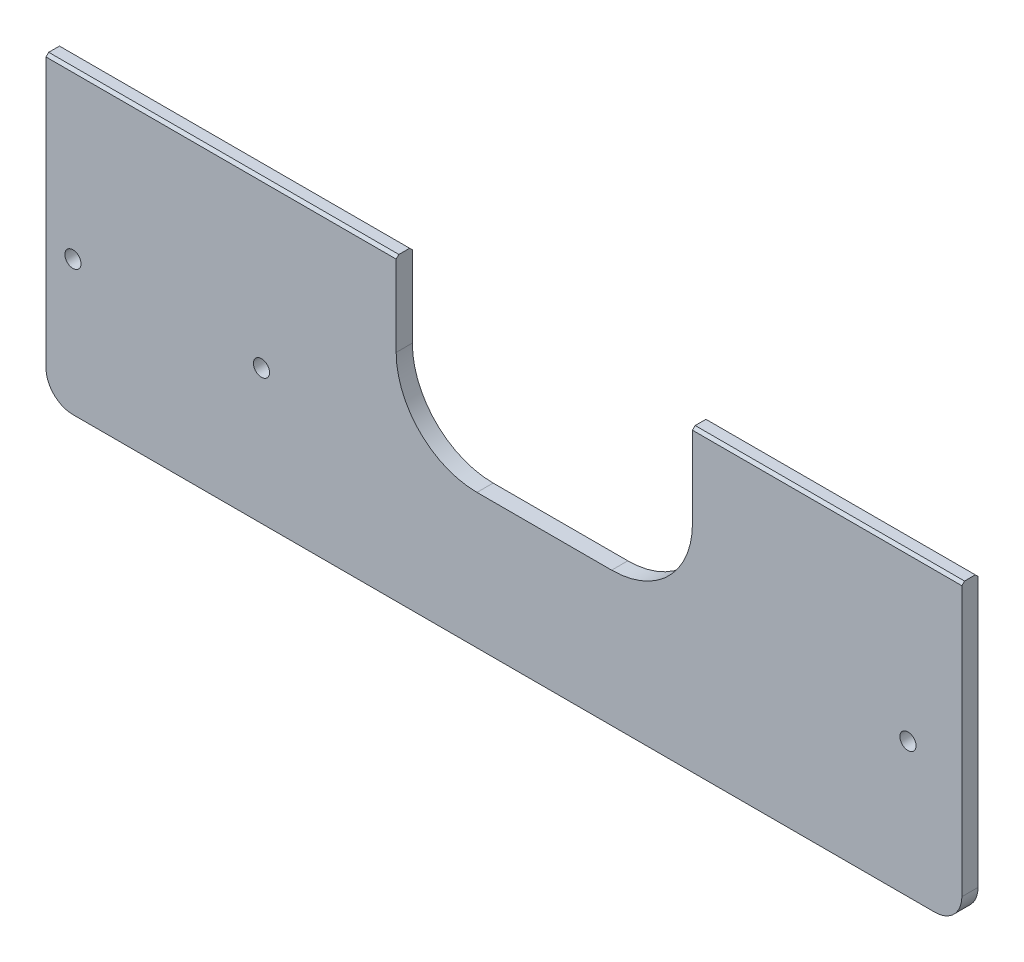
ISO-10303-21;
HEADER;
FILE_DESCRIPTION(('STEP AP214'),'2;1');
FILE_NAME('part.step','',(''),(''),'','','');
FILE_SCHEMA(('AUTOMOTIVE_DESIGN { 1 0 10303 214 1 1 1 1 }'));
ENDSEC;
DATA;
#1=APPLICATION_CONTEXT('core data for automotive mechanical design processes');
#2=APPLICATION_PROTOCOL_DEFINITION('international standard','automotive_design',2000,#1);
#3=PRODUCT_CONTEXT('',#1,'mechanical');
#4=PRODUCT('Part','Part','',(#3));
#5=PRODUCT_RELATED_PRODUCT_CATEGORY('part','',(#4));
#6=PRODUCT_DEFINITION_FORMATION('','',#4);
#7=PRODUCT_DEFINITION_CONTEXT('part definition',#1,'design');
#8=PRODUCT_DEFINITION('design','',#6,#7);
#9=PRODUCT_DEFINITION_SHAPE('','',#8);
#10=(LENGTH_UNIT() NAMED_UNIT(*) SI_UNIT(.MILLI.,.METRE.));
#11=(NAMED_UNIT(*) PLANE_ANGLE_UNIT() SI_UNIT($,.RADIAN.));
#12=(NAMED_UNIT(*) SI_UNIT($,.STERADIAN.) SOLID_ANGLE_UNIT());
#13=UNCERTAINTY_MEASURE_WITH_UNIT(LENGTH_MEASURE(1.E-05),#10,'distance_accuracy_value','');
#14=(GEOMETRIC_REPRESENTATION_CONTEXT(3) GLOBAL_UNCERTAINTY_ASSIGNED_CONTEXT((#13)) GLOBAL_UNIT_ASSIGNED_CONTEXT((#10,
#11,#12)) REPRESENTATION_CONTEXT('',''));
#15=CARTESIAN_POINT('',(0.,0.,0.));
#16=DIRECTION('',(0.,0.,1.));
#17=DIRECTION('',(1.,0.,0.));
#18=AXIS2_PLACEMENT_3D('',#15,#16,#17);
#19=CARTESIAN_POINT('',(-100.,15.,3.));
#20=DIRECTION('',(0.,-1.,0.));
#21=DIRECTION('',(0.,0.,-1.));
#22=AXIS2_PLACEMENT_3D('',#19,#20,#21);
#23=PLANE('',#22);
#24=DIRECTION('',(0.,0.,1.));
#25=VECTOR('',#24,1.);
#26=CARTESIAN_POINT('',(-35.,15.,0.));
#27=LINE('',#26,#25);
#28=CARTESIAN_POINT('',(-35.,15.,0.499999999999973));
#29=VERTEX_POINT('',#28);
#30=CARTESIAN_POINT('',(-35.,15.,2.5));
#31=VERTEX_POINT('',#30);
#32=EDGE_CURVE('E227',#29,#31,#27,.T.);
#33=ORIENTED_EDGE('',*,*,#32,.F.);
#34=DIRECTION('',(-1.,0.,0.));
#35=VECTOR('',#34,1.);
#36=CARTESIAN_POINT('',(-100.,15.,0.499999999999973));
#37=LINE('',#36,#35);
#38=CARTESIAN_POINT('',(-100.,15.,0.499999999999973));
#39=VERTEX_POINT('',#38);
#40=EDGE_CURVE('E340',#29,#39,#37,.T.);
#41=ORIENTED_EDGE('',*,*,#40,.T.);
#42=DIRECTION('',(0.,0.,-1.));
#43=VECTOR('',#42,1.);
#44=CARTESIAN_POINT('',(-100.,15.,3.));
#45=LINE('',#44,#43);
#46=CARTESIAN_POINT('',(-100.,15.,2.5));
#47=VERTEX_POINT('',#46);
#48=EDGE_CURVE('E267',#47,#39,#45,.T.);
#49=ORIENTED_EDGE('',*,*,#48,.F.);
#50=DIRECTION('',(1.,0.,0.));
#51=VECTOR('',#50,1.);
#52=CARTESIAN_POINT('',(-35.,15.,2.5));
#53=LINE('',#52,#51);
#54=EDGE_CURVE('E337',#47,#31,#53,.T.);
#55=ORIENTED_EDGE('',*,*,#54,.T.);
#56=EDGE_LOOP('',(#33,#41,#49,#55));
#57=FACE_BOUND('',#56,.T.);
#58=ADVANCED_FACE('F47',(#57),#23,.F.);
#59=CARTESIAN_POINT('',(-100.,15.,3.));
#60=DIRECTION('',(1.,0.,0.));
#61=DIRECTION('',(0.,0.,-1.));
#62=AXIS2_PLACEMENT_3D('',#59,#60,#61);
#63=PLANE('',#62);
#64=ORIENTED_EDGE('',*,*,#48,.T.);
#65=DIRECTION('',(0.,0.707106781186567,0.707106781186528));
#66=VECTOR('',#65,1.);
#67=CARTESIAN_POINT('',(-100.,15.,0.499999999999973));
#68=LINE('',#67,#66);
#69=CARTESIAN_POINT('',(-100.,14.5,0.));
#70=VERTEX_POINT('',#69);
#71=EDGE_CURVE('E346',#39,#70,#68,.F.);
#72=ORIENTED_EDGE('',*,*,#71,.T.);
#73=DIRECTION('',(0.,-1.,0.));
#74=VECTOR('',#73,1.);
#75=CARTESIAN_POINT('',(-100.,15.,0.));
#76=LINE('',#75,#74);
#77=CARTESIAN_POINT('',(-100.,-35.5,0.));
#78=VERTEX_POINT('',#77);
#79=EDGE_CURVE('E243',#70,#78,#76,.T.);
#80=ORIENTED_EDGE('',*,*,#79,.T.);
#81=DIRECTION('',(0.,0.,-1.));
#82=VECTOR('',#81,1.);
#83=CARTESIAN_POINT('',(-100.,-35.5,3.));
#84=LINE('',#83,#82);
#85=CARTESIAN_POINT('',(-100.,-35.5,3.));
#86=VERTEX_POINT('',#85);
#87=EDGE_CURVE('E298',#78,#86,#84,.F.);
#88=ORIENTED_EDGE('',*,*,#87,.T.);
#89=DIRECTION('',(0.,-1.,0.));
#90=VECTOR('',#89,1.);
#91=CARTESIAN_POINT('',(-100.,15.,3.));
#92=LINE('',#91,#90);
#93=CARTESIAN_POINT('',(-100.,14.5,3.));
#94=VERTEX_POINT('',#93);
#95=EDGE_CURVE('E255',#94,#86,#92,.T.);
#96=ORIENTED_EDGE('',*,*,#95,.F.);
#97=DIRECTION('',(0.,0.707106781186548,-0.707106781186548));
#98=VECTOR('',#97,1.);
#99=CARTESIAN_POINT('',(-100.,14.5,3.));
#100=LINE('',#99,#98);
#101=EDGE_CURVE('E72',#94,#47,#100,.T.);
#102=ORIENTED_EDGE('',*,*,#101,.T.);
#103=EDGE_LOOP('',(#64,#72,#80,#88,#96,#102));
#104=FACE_BOUND('',#103,.T.);
#105=ADVANCED_FACE('F359',(#104),#63,.F.);
#106=CARTESIAN_POINT('',(-100.,-40.5,3.));
#107=DIRECTION('',(0.,1.,0.));
#108=DIRECTION('',(0.,0.,1.));
#109=AXIS2_PLACEMENT_3D('',#106,#107,#108);
#110=PLANE('',#109);
#111=DIRECTION('',(1.,0.,0.));
#112=VECTOR('',#111,1.);
#113=CARTESIAN_POINT('',(-100.,-40.5,3.));
#114=LINE('',#113,#112);
#115=CARTESIAN_POINT('',(-95.,-40.5,3.));
#116=VERTEX_POINT('',#115);
#117=CARTESIAN_POINT('',(65.,-40.5,3.));
#118=VERTEX_POINT('',#117);
#119=EDGE_CURVE('E258',#116,#118,#114,.T.);
#120=ORIENTED_EDGE('',*,*,#119,.F.);
#121=DIRECTION('',(0.,0.,-1.));
#122=VECTOR('',#121,1.);
#123=CARTESIAN_POINT('',(-95.,-40.5,3.));
#124=LINE('',#123,#122);
#125=CARTESIAN_POINT('',(-95.,-40.5,0.));
#126=VERTEX_POINT('',#125);
#127=EDGE_CURVE('E287',#116,#126,#124,.T.);
#128=ORIENTED_EDGE('',*,*,#127,.T.);
#129=DIRECTION('',(1.,0.,0.));
#130=VECTOR('',#129,1.);
#131=CARTESIAN_POINT('',(-100.,-40.5,0.));
#132=LINE('',#131,#130);
#133=CARTESIAN_POINT('',(65.,-40.5,0.));
#134=VERTEX_POINT('',#133);
#135=EDGE_CURVE('E270',#126,#134,#132,.T.);
#136=ORIENTED_EDGE('',*,*,#135,.T.);
#137=DIRECTION('',(0.,0.,-1.));
#138=VECTOR('',#137,1.);
#139=CARTESIAN_POINT('',(65.,-40.5,3.));
#140=LINE('',#139,#138);
#141=EDGE_CURVE('E284',#134,#118,#140,.F.);
#142=ORIENTED_EDGE('',*,*,#141,.T.);
#143=EDGE_LOOP('',(#120,#128,#136,#142));
#144=FACE_BOUND('',#143,.T.);
#145=ADVANCED_FACE('F370',(#144),#110,.F.);
#146=CARTESIAN_POINT('',(70.,15.,3.));
#147=DIRECTION('',(-1.,0.,0.));
#148=DIRECTION('',(0.,-1.,0.));
#149=AXIS2_PLACEMENT_3D('',#146,#147,#148);
#150=PLANE('',#149);
#151=DIRECTION('',(0.,1.,0.));
#152=VECTOR('',#151,1.);
#153=CARTESIAN_POINT('',(70.,15.,0.));
#154=LINE('',#153,#152);
#155=CARTESIAN_POINT('',(70.,-35.5,0.));
#156=VERTEX_POINT('',#155);
#157=CARTESIAN_POINT('',(70.,14.5,0.));
#158=VERTEX_POINT('',#157);
#159=EDGE_CURVE('E259',#156,#158,#154,.T.);
#160=ORIENTED_EDGE('',*,*,#159,.T.);
#161=DIRECTION('',(0.,-0.707106781186567,-0.707106781186528));
#162=VECTOR('',#161,1.);
#163=CARTESIAN_POINT('',(70.,15.,0.499999999999951));
#164=LINE('',#163,#162);
#165=CARTESIAN_POINT('',(70.,15.,0.499999999999973));
#166=VERTEX_POINT('',#165);
#167=EDGE_CURVE('E334',#158,#166,#164,.F.);
#168=ORIENTED_EDGE('',*,*,#167,.T.);
#169=DIRECTION('',(0.,0.,-1.));
#170=VECTOR('',#169,1.);
#171=CARTESIAN_POINT('',(70.,15.,3.));
#172=LINE('',#171,#170);
#173=CARTESIAN_POINT('',(70.,15.,2.5));
#174=VERTEX_POINT('',#173);
#175=EDGE_CURVE('E280',#174,#166,#172,.T.);
#176=ORIENTED_EDGE('',*,*,#175,.F.);
#177=DIRECTION('',(0.,-0.707106781186548,0.707106781186548));
#178=VECTOR('',#177,1.);
#179=CARTESIAN_POINT('',(70.,14.5,3.00000000000001));
#180=LINE('',#179,#178);
#181=CARTESIAN_POINT('',(70.,14.5,3.));
#182=VERTEX_POINT('',#181);
#183=EDGE_CURVE('E331',#174,#182,#180,.T.);
#184=ORIENTED_EDGE('',*,*,#183,.T.);
#185=DIRECTION('',(0.,1.,0.));
#186=VECTOR('',#185,1.);
#187=CARTESIAN_POINT('',(70.,15.,3.));
#188=LINE('',#187,#186);
#189=CARTESIAN_POINT('',(70.,-35.5,3.));
#190=VERTEX_POINT('',#189);
#191=EDGE_CURVE('E263',#190,#182,#188,.T.);
#192=ORIENTED_EDGE('',*,*,#191,.F.);
#193=DIRECTION('',(0.,0.,-1.));
#194=VECTOR('',#193,1.);
#195=CARTESIAN_POINT('',(70.,-35.5,3.));
#196=LINE('',#195,#194);
#197=EDGE_CURVE('E308',#190,#156,#196,.T.);
#198=ORIENTED_EDGE('',*,*,#197,.T.);
#199=EDGE_LOOP('',(#160,#168,#176,#184,#192,#198));
#200=FACE_BOUND('',#199,.T.);
#201=ADVANCED_FACE('F379',(#200),#150,.F.);
#202=ORIENTED_EDGE('',*,*,#175,.T.);
#203=DIRECTION('',(-1.,0.,0.));
#204=VECTOR('',#203,1.);
#205=CARTESIAN_POINT('',(-100.,15.,0.499999999999973));
#206=LINE('',#205,#204);
#207=CARTESIAN_POINT('',(20.,15.,0.499999999999973));
#208=VERTEX_POINT('',#207);
#209=EDGE_CURVE('E315',#166,#208,#206,.T.);
#210=ORIENTED_EDGE('',*,*,#209,.T.);
#211=DIRECTION('',(0.,0.,1.));
#212=VECTOR('',#211,1.);
#213=CARTESIAN_POINT('',(20.,15.,0.));
#214=LINE('',#213,#212);
#215=CARTESIAN_POINT('',(20.,15.,2.5));
#216=VERTEX_POINT('',#215);
#217=EDGE_CURVE('E230',#208,#216,#214,.T.);
#218=ORIENTED_EDGE('',*,*,#217,.T.);
#219=DIRECTION('',(1.,0.,0.));
#220=VECTOR('',#219,1.);
#221=CARTESIAN_POINT('',(70.,15.,2.5));
#222=LINE('',#221,#220);
#223=EDGE_CURVE('E312',#216,#174,#222,.T.);
#224=ORIENTED_EDGE('',*,*,#223,.T.);
#225=EDGE_LOOP('',(#202,#210,#218,#224));
#226=FACE_BOUND('',#225,.T.);
#227=ADVANCED_FACE('F400',(#226),#23,.F.);
#228=CARTESIAN_POINT('',(0.,0.,3.));
#229=DIRECTION('',(0.,0.,1.));
#230=DIRECTION('',(1.,0.,0.));
#231=AXIS2_PLACEMENT_3D('',#228,#229,#230);
#232=PLANE('',#231);
#233=CARTESIAN_POINT('',(-95.,-15.5,3.));
#234=DIRECTION('',(0.,0.,1.));
#235=DIRECTION('',(1.,0.,0.));
#236=AXIS2_PLACEMENT_3D('',#233,#234,#235);
#237=CIRCLE('',#236,1.5);
#238=CARTESIAN_POINT('',(-93.5,-15.5,3.));
#239=VERTEX_POINT('',#238);
#240=EDGE_CURVE('E200',#239,#239,#237,.T.);
#241=ORIENTED_EDGE('',*,*,#240,.F.);
#242=EDGE_LOOP('',(#241));
#243=FACE_BOUND('',#242,.T.);
#244=ORIENTED_EDGE('',*,*,#191,.T.);
#245=DIRECTION('',(-1.,0.,0.));
#246=VECTOR('',#245,1.);
#247=CARTESIAN_POINT('',(20.,14.5,3.));
#248=LINE('',#247,#246);
#249=CARTESIAN_POINT('',(20.,14.5,3.));
#250=VERTEX_POINT('',#249);
#251=EDGE_CURVE('E11',#182,#250,#248,.T.);
#252=ORIENTED_EDGE('',*,*,#251,.T.);
#253=DIRECTION('',(0.,1.,0.));
#254=VECTOR('',#253,1.);
#255=CARTESIAN_POINT('',(20.,15.,3.));
#256=LINE('',#255,#254);
#257=CARTESIAN_POINT('',(20.,-0.5,3.));
#258=VERTEX_POINT('',#257);
#259=EDGE_CURVE('E197',#258,#250,#256,.T.);
#260=ORIENTED_EDGE('',*,*,#259,.F.);
#261=CARTESIAN_POINT('',(5.,-0.5,3.));
#262=DIRECTION('',(0.,0.,1.));
#263=DIRECTION('',(1.,0.,0.));
#264=AXIS2_PLACEMENT_3D('',#261,#262,#263);
#265=CIRCLE('',#264,15.);
#266=CARTESIAN_POINT('',(5.,-15.5,3.));
#267=VERTEX_POINT('',#266);
#268=EDGE_CURVE('E216',#267,#258,#265,.T.);
#269=ORIENTED_EDGE('',*,*,#268,.F.);
#270=DIRECTION('',(1.,0.,0.));
#271=VECTOR('',#270,1.);
#272=CARTESIAN_POINT('',(-20.,-15.5,3.));
#273=LINE('',#272,#271);
#274=CARTESIAN_POINT('',(-20.,-15.5,3.));
#275=VERTEX_POINT('',#274);
#276=EDGE_CURVE('E212',#275,#267,#273,.T.);
#277=ORIENTED_EDGE('',*,*,#276,.F.);
#278=CARTESIAN_POINT('',(-20.,-0.500000000000001,3.));
#279=DIRECTION('',(0.,0.,1.));
#280=DIRECTION('',(1.,0.,0.));
#281=AXIS2_PLACEMENT_3D('',#278,#279,#280);
#282=CIRCLE('',#281,15.);
#283=CARTESIAN_POINT('',(-35.,-0.499999999999999,3.));
#284=VERTEX_POINT('',#283);
#285=EDGE_CURVE('E171',#284,#275,#282,.T.);
#286=ORIENTED_EDGE('',*,*,#285,.F.);
#287=DIRECTION('',(0.,-1.,0.));
#288=VECTOR('',#287,1.);
#289=CARTESIAN_POINT('',(-35.,-0.499999999999999,3.));
#290=LINE('',#289,#288);
#291=CARTESIAN_POINT('',(-35.,14.5,3.));
#292=VERTEX_POINT('',#291);
#293=EDGE_CURVE('E194',#292,#284,#290,.T.);
#294=ORIENTED_EDGE('',*,*,#293,.F.);
#295=DIRECTION('',(-1.,0.,0.));
#296=VECTOR('',#295,1.);
#297=CARTESIAN_POINT('',(-100.,14.5,3.));
#298=LINE('',#297,#296);
#299=EDGE_CURVE('E57',#292,#94,#298,.T.);
#300=ORIENTED_EDGE('',*,*,#299,.T.);
#301=ORIENTED_EDGE('',*,*,#95,.T.);
#302=CARTESIAN_POINT('',(-95.,-35.5,3.));
#303=DIRECTION('',(0.,0.,1.));
#304=DIRECTION('',(1.,0.,0.));
#305=AXIS2_PLACEMENT_3D('',#302,#303,#304);
#306=CIRCLE('',#305,5.);
#307=EDGE_CURVE('E305',#86,#116,#306,.T.);
#308=ORIENTED_EDGE('',*,*,#307,.T.);
#309=ORIENTED_EDGE('',*,*,#119,.T.);
#310=CARTESIAN_POINT('',(65.,-35.5,3.));
#311=DIRECTION('',(0.,0.,1.));
#312=DIRECTION('',(1.,0.,0.));
#313=AXIS2_PLACEMENT_3D('',#310,#311,#312);
#314=CIRCLE('',#313,5.);
#315=EDGE_CURVE('E302',#118,#190,#314,.T.);
#316=ORIENTED_EDGE('',*,*,#315,.T.);
#317=EDGE_LOOP('',(#244,#252,#260,#269,#277,#286,#294,#300,#301,#308,#309,#316));
#318=FACE_BOUND('',#317,.T.);
#319=CARTESIAN_POINT('',(60.,-15.5,3.));
#320=DIRECTION('',(0.,0.,1.));
#321=DIRECTION('',(1.,0.,0.));
#322=AXIS2_PLACEMENT_3D('',#319,#320,#321);
#323=CIRCLE('',#322,1.49999999999999);
#324=CARTESIAN_POINT('',(61.5,-15.5,3.));
#325=VERTEX_POINT('',#324);
#326=EDGE_CURVE('E244',#325,#325,#323,.T.);
#327=ORIENTED_EDGE('',*,*,#326,.F.);
#328=EDGE_LOOP('',(#327));
#329=FACE_BOUND('',#328,.T.);
#330=CARTESIAN_POINT('',(-60.,-15.5,3.));
#331=DIRECTION('',(0.,0.,1.));
#332=DIRECTION('',(1.,0.,0.));
#333=AXIS2_PLACEMENT_3D('',#330,#331,#332);
#334=CIRCLE('',#333,1.5);
#335=CARTESIAN_POINT('',(-58.5,-15.5,3.));
#336=VERTEX_POINT('',#335);
#337=EDGE_CURVE('E248',#336,#336,#334,.T.);
#338=ORIENTED_EDGE('',*,*,#337,.F.);
#339=EDGE_LOOP('',(#338));
#340=FACE_BOUND('',#339,.T.);
#341=ADVANCED_FACE('F356',(#243,#318,#329,#340),#232,.T.);
#342=CARTESIAN_POINT('',(0.,0.,0.));
#343=DIRECTION('',(0.,0.,1.));
#344=DIRECTION('',(1.,0.,0.));
#345=AXIS2_PLACEMENT_3D('',#342,#343,#344);
#346=PLANE('',#345);
#347=CARTESIAN_POINT('',(-95.,-15.5,0.));
#348=DIRECTION('',(0.,0.,1.));
#349=DIRECTION('',(1.,0.,0.));
#350=AXIS2_PLACEMENT_3D('',#347,#348,#349);
#351=CIRCLE('',#350,1.5);
#352=CARTESIAN_POINT('',(-93.5,-15.5,0.));
#353=VERTEX_POINT('',#352);
#354=EDGE_CURVE('E213',#353,#353,#351,.T.);
#355=ORIENTED_EDGE('',*,*,#354,.T.);
#356=EDGE_LOOP('',(#355));
#357=FACE_BOUND('',#356,.T.);
#358=DIRECTION('',(0.,1.,0.));
#359=VECTOR('',#358,1.);
#360=CARTESIAN_POINT('',(20.,15.,0.));
#361=LINE('',#360,#359);
#362=CARTESIAN_POINT('',(20.,-0.5,0.));
#363=VERTEX_POINT('',#362);
#364=CARTESIAN_POINT('',(20.,14.5,0.));
#365=VERTEX_POINT('',#364);
#366=EDGE_CURVE('E205',#363,#365,#361,.T.);
#367=ORIENTED_EDGE('',*,*,#366,.T.);
#368=DIRECTION('',(1.,0.,0.));
#369=VECTOR('',#368,1.);
#370=CARTESIAN_POINT('',(0.,14.5,0.));
#371=LINE('',#370,#369);
#372=EDGE_CURVE('E328',#365,#158,#371,.T.);
#373=ORIENTED_EDGE('',*,*,#372,.T.);
#374=ORIENTED_EDGE('',*,*,#159,.F.);
#375=CARTESIAN_POINT('',(65.,-35.5,0.));
#376=DIRECTION('',(0.,0.,1.));
#377=DIRECTION('',(1.,0.,0.));
#378=AXIS2_PLACEMENT_3D('',#375,#376,#377);
#379=CIRCLE('',#378,5.);
#380=EDGE_CURVE('E291',#156,#134,#379,.F.);
#381=ORIENTED_EDGE('',*,*,#380,.T.);
#382=ORIENTED_EDGE('',*,*,#135,.F.);
#383=CARTESIAN_POINT('',(-95.,-35.5,0.));
#384=DIRECTION('',(0.,0.,1.));
#385=DIRECTION('',(1.,0.,0.));
#386=AXIS2_PLACEMENT_3D('',#383,#384,#385);
#387=CIRCLE('',#386,5.);
#388=EDGE_CURVE('E294',#126,#78,#387,.F.);
#389=ORIENTED_EDGE('',*,*,#388,.T.);
#390=ORIENTED_EDGE('',*,*,#79,.F.);
#391=DIRECTION('',(1.,0.,0.));
#392=VECTOR('',#391,1.);
#393=CARTESIAN_POINT('',(0.,14.5,0.));
#394=LINE('',#393,#392);
#395=CARTESIAN_POINT('',(-35.,14.5,0.));
#396=VERTEX_POINT('',#395);
#397=EDGE_CURVE('E325',#70,#396,#394,.T.);
#398=ORIENTED_EDGE('',*,*,#397,.T.);
#399=DIRECTION('',(0.,-1.,0.));
#400=VECTOR('',#399,1.);
#401=CARTESIAN_POINT('',(-35.,-0.499999999999999,0.));
#402=LINE('',#401,#400);
#403=CARTESIAN_POINT('',(-35.,-0.499999999999999,0.));
#404=VERTEX_POINT('',#403);
#405=EDGE_CURVE('E177',#396,#404,#402,.T.);
#406=ORIENTED_EDGE('',*,*,#405,.T.);
#407=CARTESIAN_POINT('',(-20.,-0.500000000000001,0.));
#408=DIRECTION('',(0.,0.,1.));
#409=DIRECTION('',(1.,0.,0.));
#410=AXIS2_PLACEMENT_3D('',#407,#408,#409);
#411=CIRCLE('',#410,15.);
#412=CARTESIAN_POINT('',(-20.,-15.5,0.));
#413=VERTEX_POINT('',#412);
#414=EDGE_CURVE('E169',#404,#413,#411,.T.);
#415=ORIENTED_EDGE('',*,*,#414,.T.);
#416=DIRECTION('',(1.,0.,0.));
#417=VECTOR('',#416,1.);
#418=CARTESIAN_POINT('',(-20.,-15.5,0.));
#419=LINE('',#418,#417);
#420=CARTESIAN_POINT('',(5.,-15.5,0.));
#421=VERTEX_POINT('',#420);
#422=EDGE_CURVE('E181',#413,#421,#419,.T.);
#423=ORIENTED_EDGE('',*,*,#422,.T.);
#424=CARTESIAN_POINT('',(5.,-0.5,0.));
#425=DIRECTION('',(0.,0.,1.));
#426=DIRECTION('',(1.,0.,0.));
#427=AXIS2_PLACEMENT_3D('',#424,#425,#426);
#428=CIRCLE('',#427,15.);
#429=EDGE_CURVE('E186',#421,#363,#428,.T.);
#430=ORIENTED_EDGE('',*,*,#429,.T.);
#431=EDGE_LOOP('',(#367,#373,#374,#381,#382,#389,#390,#398,#406,#415,#423,#430));
#432=FACE_BOUND('',#431,.T.);
#433=CARTESIAN_POINT('',(60.,-15.5,0.));
#434=DIRECTION('',(0.,0.,1.));
#435=DIRECTION('',(1.,0.,0.));
#436=AXIS2_PLACEMENT_3D('',#433,#434,#435);
#437=CIRCLE('',#436,1.49999999999999);
#438=CARTESIAN_POINT('',(61.5,-15.5,0.));
#439=VERTEX_POINT('',#438);
#440=EDGE_CURVE('E239',#439,#439,#437,.T.);
#441=ORIENTED_EDGE('',*,*,#440,.T.);
#442=EDGE_LOOP('',(#441));
#443=FACE_BOUND('',#442,.T.);
#444=CARTESIAN_POINT('',(-60.,-15.5,0.));
#445=DIRECTION('',(0.,0.,1.));
#446=DIRECTION('',(1.,0.,0.));
#447=AXIS2_PLACEMENT_3D('',#444,#445,#446);
#448=CIRCLE('',#447,1.5);
#449=CARTESIAN_POINT('',(-58.5,-15.5,0.));
#450=VERTEX_POINT('',#449);
#451=EDGE_CURVE('E226',#450,#450,#448,.T.);
#452=ORIENTED_EDGE('',*,*,#451,.T.);
#453=EDGE_LOOP('',(#452));
#454=FACE_BOUND('',#453,.T.);
#455=ADVANCED_FACE('F189',(#357,#432,#443,#454),#346,.F.);
#456=CARTESIAN_POINT('',(-60.,-15.5,0.));
#457=DIRECTION('',(0.,0.,1.));
#458=DIRECTION('',(1.,0.,0.));
#459=AXIS2_PLACEMENT_3D('',#456,#457,#458);
#460=CYLINDRICAL_SURFACE('',#459,1.5);
#461=ORIENTED_EDGE('',*,*,#451,.F.);
#462=EDGE_LOOP('',(#461));
#463=FACE_BOUND('',#462,.T.);
#464=ORIENTED_EDGE('',*,*,#337,.T.);
#465=EDGE_LOOP('',(#464));
#466=FACE_BOUND('',#465,.T.);
#467=ADVANCED_FACE('F444',(#463,#466),#460,.F.);
#468=CARTESIAN_POINT('',(60.,-15.5,0.));
#469=DIRECTION('',(0.,0.,1.));
#470=DIRECTION('',(1.,0.,0.));
#471=AXIS2_PLACEMENT_3D('',#468,#469,#470);
#472=CYLINDRICAL_SURFACE('',#471,1.49999999999999);
#473=ORIENTED_EDGE('',*,*,#440,.F.);
#474=EDGE_LOOP('',(#473));
#475=FACE_BOUND('',#474,.T.);
#476=ORIENTED_EDGE('',*,*,#326,.T.);
#477=EDGE_LOOP('',(#476));
#478=FACE_BOUND('',#477,.T.);
#479=ADVANCED_FACE('F433',(#475,#478),#472,.F.);
#480=CARTESIAN_POINT('',(-20.,-0.500000000000001,0.));
#481=DIRECTION('',(0.,0.,1.));
#482=DIRECTION('',(1.,0.,0.));
#483=AXIS2_PLACEMENT_3D('',#480,#481,#482);
#484=CYLINDRICAL_SURFACE('',#483,15.);
#485=ORIENTED_EDGE('',*,*,#285,.T.);
#486=DIRECTION('',(0.,0.,1.));
#487=VECTOR('',#486,1.);
#488=CARTESIAN_POINT('',(-20.,-15.5,0.));
#489=LINE('',#488,#487);
#490=EDGE_CURVE('E164',#413,#275,#489,.T.);
#491=ORIENTED_EDGE('',*,*,#490,.F.);
#492=ORIENTED_EDGE('',*,*,#414,.F.);
#493=DIRECTION('',(0.,0.,1.));
#494=VECTOR('',#493,1.);
#495=CARTESIAN_POINT('',(-35.,-0.499999999999999,0.));
#496=LINE('',#495,#494);
#497=EDGE_CURVE('E223',#404,#284,#496,.T.);
#498=ORIENTED_EDGE('',*,*,#497,.T.);
#499=EDGE_LOOP('',(#485,#491,#492,#498));
#500=FACE_BOUND('',#499,.T.);
#501=ADVANCED_FACE('F166',(#500),#484,.F.);
#502=CARTESIAN_POINT('',(-35.,-0.499999999999999,0.));
#503=DIRECTION('',(-1.,0.,0.));
#504=DIRECTION('',(0.,0.,1.));
#505=AXIS2_PLACEMENT_3D('',#502,#503,#504);
#506=PLANE('',#505);
#507=ORIENTED_EDGE('',*,*,#405,.F.);
#508=DIRECTION('',(0.,-0.707106781186567,-0.707106781186528));
#509=VECTOR('',#508,1.);
#510=CARTESIAN_POINT('',(-35.,15.,0.499999999999973));
#511=LINE('',#510,#509);
#512=EDGE_CURVE('E351',#396,#29,#511,.F.);
#513=ORIENTED_EDGE('',*,*,#512,.T.);
#514=ORIENTED_EDGE('',*,*,#32,.T.);
#515=DIRECTION('',(0.,-0.707106781186548,0.707106781186548));
#516=VECTOR('',#515,1.);
#517=CARTESIAN_POINT('',(-35.,14.5,3.));
#518=LINE('',#517,#516);
#519=EDGE_CURVE('E64',#31,#292,#518,.T.);
#520=ORIENTED_EDGE('',*,*,#519,.T.);
#521=ORIENTED_EDGE('',*,*,#293,.T.);
#522=ORIENTED_EDGE('',*,*,#497,.F.);
#523=EDGE_LOOP('',(#507,#513,#514,#520,#521,#522));
#524=FACE_BOUND('',#523,.T.);
#525=ADVANCED_FACE('F424',(#524),#506,.F.);
#526=CARTESIAN_POINT('',(20.,15.,0.));
#527=DIRECTION('',(1.,0.,0.));
#528=DIRECTION('',(0.,1.,0.));
#529=AXIS2_PLACEMENT_3D('',#526,#527,#528);
#530=PLANE('',#529);
#531=ORIENTED_EDGE('',*,*,#217,.F.);
#532=DIRECTION('',(0.,0.707106781186567,0.707106781186528));
#533=VECTOR('',#532,1.);
#534=CARTESIAN_POINT('',(20.,15.,0.499999999999959));
#535=LINE('',#534,#533);
#536=EDGE_CURVE('E322',#208,#365,#535,.F.);
#537=ORIENTED_EDGE('',*,*,#536,.T.);
#538=ORIENTED_EDGE('',*,*,#366,.F.);
#539=DIRECTION('',(0.,0.,1.));
#540=VECTOR('',#539,1.);
#541=CARTESIAN_POINT('',(20.,-0.5,0.));
#542=LINE('',#541,#540);
#543=EDGE_CURVE('E234',#363,#258,#542,.T.);
#544=ORIENTED_EDGE('',*,*,#543,.T.);
#545=ORIENTED_EDGE('',*,*,#259,.T.);
#546=DIRECTION('',(0.,0.707106781186548,-0.707106781186548));
#547=VECTOR('',#546,1.);
#548=CARTESIAN_POINT('',(20.,14.5,3.));
#549=LINE('',#548,#547);
#550=EDGE_CURVE('E319',#250,#216,#549,.T.);
#551=ORIENTED_EDGE('',*,*,#550,.T.);
#552=EDGE_LOOP('',(#531,#537,#538,#544,#545,#551));
#553=FACE_BOUND('',#552,.T.);
#554=ADVANCED_FACE('F390',(#553),#530,.F.);
#555=CARTESIAN_POINT('',(5.,-0.5,0.));
#556=DIRECTION('',(0.,0.,1.));
#557=DIRECTION('',(1.,0.,0.));
#558=AXIS2_PLACEMENT_3D('',#555,#556,#557);
#559=CYLINDRICAL_SURFACE('',#558,15.);
#560=ORIENTED_EDGE('',*,*,#268,.T.);
#561=ORIENTED_EDGE('',*,*,#543,.F.);
#562=ORIENTED_EDGE('',*,*,#429,.F.);
#563=DIRECTION('',(0.,0.,1.));
#564=VECTOR('',#563,1.);
#565=CARTESIAN_POINT('',(5.,-15.5,0.));
#566=LINE('',#565,#564);
#567=EDGE_CURVE('E176',#421,#267,#566,.T.);
#568=ORIENTED_EDGE('',*,*,#567,.T.);
#569=EDGE_LOOP('',(#560,#561,#562,#568));
#570=FACE_BOUND('',#569,.T.);
#571=ADVANCED_FACE('F393',(#570),#559,.F.);
#572=CARTESIAN_POINT('',(-20.,-15.5,0.));
#573=DIRECTION('',(0.,-1.,0.));
#574=DIRECTION('',(0.,0.,-1.));
#575=AXIS2_PLACEMENT_3D('',#572,#573,#574);
#576=PLANE('',#575);
#577=ORIENTED_EDGE('',*,*,#276,.T.);
#578=ORIENTED_EDGE('',*,*,#567,.F.);
#579=ORIENTED_EDGE('',*,*,#422,.F.);
#580=ORIENTED_EDGE('',*,*,#490,.T.);
#581=EDGE_LOOP('',(#577,#578,#579,#580));
#582=FACE_BOUND('',#581,.T.);
#583=ADVANCED_FACE('F182',(#582),#576,.F.);
#584=CARTESIAN_POINT('',(-95.,-35.5,3.));
#585=DIRECTION('',(0.,0.,-1.));
#586=DIRECTION('',(-1.,0.,0.));
#587=AXIS2_PLACEMENT_3D('',#584,#585,#586);
#588=CYLINDRICAL_SURFACE('',#587,5.);
#589=ORIENTED_EDGE('',*,*,#307,.F.);
#590=ORIENTED_EDGE('',*,*,#87,.F.);
#591=ORIENTED_EDGE('',*,*,#388,.F.);
#592=ORIENTED_EDGE('',*,*,#127,.F.);
#593=EDGE_LOOP('',(#589,#590,#591,#592));
#594=FACE_BOUND('',#593,.T.);
#595=ADVANCED_FACE('F366',(#594),#588,.T.);
#596=CARTESIAN_POINT('',(65.,-35.5,3.));
#597=DIRECTION('',(0.,0.,-1.));
#598=DIRECTION('',(-1.,0.,0.));
#599=AXIS2_PLACEMENT_3D('',#596,#597,#598);
#600=CYLINDRICAL_SURFACE('',#599,5.);
#601=ORIENTED_EDGE('',*,*,#315,.F.);
#602=ORIENTED_EDGE('',*,*,#141,.F.);
#603=ORIENTED_EDGE('',*,*,#380,.F.);
#604=ORIENTED_EDGE('',*,*,#197,.F.);
#605=EDGE_LOOP('',(#601,#602,#603,#604));
#606=FACE_BOUND('',#605,.T.);
#607=ADVANCED_FACE('F374',(#606),#600,.T.);
#608=CARTESIAN_POINT('',(-95.,-15.5,0.));
#609=DIRECTION('',(0.,0.,1.));
#610=DIRECTION('',(1.,0.,0.));
#611=AXIS2_PLACEMENT_3D('',#608,#609,#610);
#612=CYLINDRICAL_SURFACE('',#611,1.5);
#613=ORIENTED_EDGE('',*,*,#354,.F.);
#614=EDGE_LOOP('',(#613));
#615=FACE_BOUND('',#614,.T.);
#616=ORIENTED_EDGE('',*,*,#240,.T.);
#617=EDGE_LOOP('',(#616));
#618=FACE_BOUND('',#617,.T.);
#619=ADVANCED_FACE('F436',(#615,#618),#612,.F.);
#620=CARTESIAN_POINT('',(-100.,15.,0.499999999999973));
#621=DIRECTION('',(0.,-0.707106781186528,0.707106781186567));
#622=DIRECTION('',(-1.,0.,0.));
#623=AXIS2_PLACEMENT_3D('',#620,#621,#622);
#624=PLANE('',#623);
#625=ORIENTED_EDGE('',*,*,#167,.F.);
#626=ORIENTED_EDGE('',*,*,#372,.F.);
#627=ORIENTED_EDGE('',*,*,#536,.F.);
#628=ORIENTED_EDGE('',*,*,#209,.F.);
#629=EDGE_LOOP('',(#625,#626,#627,#628));
#630=FACE_BOUND('',#629,.T.);
#631=ADVANCED_FACE('F397',(#630),#624,.F.);
#632=CARTESIAN_POINT('',(-100.,15.,0.499999999999973));
#633=DIRECTION('',(0.,-0.707106781186528,0.707106781186567));
#634=DIRECTION('',(-1.,0.,0.));
#635=AXIS2_PLACEMENT_3D('',#632,#633,#634);
#636=PLANE('',#635);
#637=ORIENTED_EDGE('',*,*,#512,.F.);
#638=ORIENTED_EDGE('',*,*,#397,.F.);
#639=ORIENTED_EDGE('',*,*,#71,.F.);
#640=ORIENTED_EDGE('',*,*,#40,.F.);
#641=EDGE_LOOP('',(#637,#638,#639,#640));
#642=FACE_BOUND('',#641,.T.);
#643=ADVANCED_FACE('F422',(#642),#636,.F.);
#644=CARTESIAN_POINT('',(0.,14.5,3.));
#645=DIRECTION('',(0.,0.707106781186547,0.707106781186547));
#646=DIRECTION('',(1.,0.,0.));
#647=AXIS2_PLACEMENT_3D('',#644,#645,#646);
#648=PLANE('',#647);
#649=ORIENTED_EDGE('',*,*,#183,.F.);
#650=ORIENTED_EDGE('',*,*,#223,.F.);
#651=ORIENTED_EDGE('',*,*,#550,.F.);
#652=ORIENTED_EDGE('',*,*,#251,.F.);
#653=EDGE_LOOP('',(#649,#650,#651,#652));
#654=FACE_BOUND('',#653,.T.);
#655=ADVANCED_FACE('F385',(#654),#648,.T.);
#656=CARTESIAN_POINT('',(0.,14.5,3.));
#657=DIRECTION('',(0.,0.707106781186547,0.707106781186547));
#658=DIRECTION('',(1.,0.,0.));
#659=AXIS2_PLACEMENT_3D('',#656,#657,#658);
#660=PLANE('',#659);
#661=ORIENTED_EDGE('',*,*,#519,.F.);
#662=ORIENTED_EDGE('',*,*,#54,.F.);
#663=ORIENTED_EDGE('',*,*,#101,.F.);
#664=ORIENTED_EDGE('',*,*,#299,.F.);
#665=EDGE_LOOP('',(#661,#662,#663,#664));
#666=FACE_BOUND('',#665,.T.);
#667=ADVANCED_FACE('F50',(#666),#660,.T.);
#668=CLOSED_SHELL('',(#58,#105,#145,#201,#227,#341,#455,#467,#479,#501,#525,#554,#571,#583,#595,
#607,#619,#631,#643,#655,#667));
#669=MANIFOLD_SOLID_BREP('B2',#668);
#670=ADVANCED_BREP_SHAPE_REPRESENTATION('',(#18,#669),#14);
#671=SHAPE_DEFINITION_REPRESENTATION(#9,#670);
ENDSEC;
END-ISO-10303-21;
